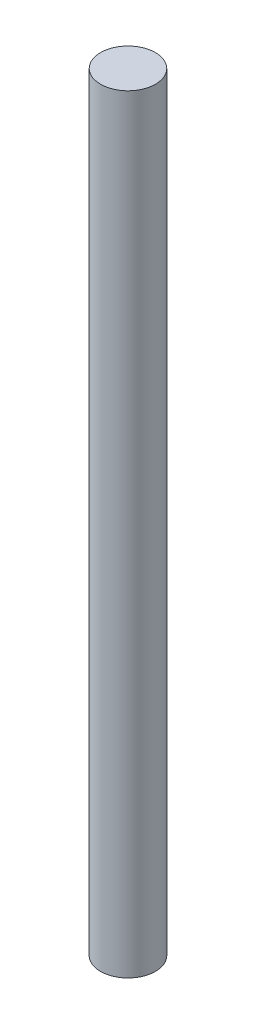
ISO-10303-21;
HEADER;
FILE_DESCRIPTION(('STEP AP214'),'2;1');
FILE_NAME('part.step','',(''),(''),'','','');
FILE_SCHEMA(('AUTOMOTIVE_DESIGN { 1 0 10303 214 1 1 1 1 }'));
ENDSEC;
DATA;
#1=APPLICATION_CONTEXT('core data for automotive mechanical design processes');
#2=APPLICATION_PROTOCOL_DEFINITION('international standard','automotive_design',2000,#1);
#3=PRODUCT_CONTEXT('',#1,'mechanical');
#4=PRODUCT('Part','Part','',(#3));
#5=PRODUCT_RELATED_PRODUCT_CATEGORY('part','',(#4));
#6=PRODUCT_DEFINITION_FORMATION('','',#4);
#7=PRODUCT_DEFINITION_CONTEXT('part definition',#1,'design');
#8=PRODUCT_DEFINITION('design','',#6,#7);
#9=PRODUCT_DEFINITION_SHAPE('','',#8);
#10=(LENGTH_UNIT() NAMED_UNIT(*) SI_UNIT(.MILLI.,.METRE.));
#11=(NAMED_UNIT(*) PLANE_ANGLE_UNIT() SI_UNIT($,.RADIAN.));
#12=(NAMED_UNIT(*) SI_UNIT($,.STERADIAN.) SOLID_ANGLE_UNIT());
#13=UNCERTAINTY_MEASURE_WITH_UNIT(LENGTH_MEASURE(1.E-05),#10,'distance_accuracy_value','');
#14=(GEOMETRIC_REPRESENTATION_CONTEXT(3) GLOBAL_UNCERTAINTY_ASSIGNED_CONTEXT((#13)) GLOBAL_UNIT_ASSIGNED_CONTEXT((#10,
#11,#12)) REPRESENTATION_CONTEXT('',''));
#15=CARTESIAN_POINT('',(0.,0.,0.));
#16=DIRECTION('',(0.,0.,1.));
#17=DIRECTION('',(1.,0.,0.));
#18=AXIS2_PLACEMENT_3D('',#15,#16,#17);
#19=CARTESIAN_POINT('',(0.,140.,0.));
#20=DIRECTION('',(0.,-1.,0.));
#21=DIRECTION('',(0.,0.,-1.));
#22=AXIS2_PLACEMENT_3D('',#19,#20,#21);
#23=CYLINDRICAL_SURFACE('',#22,5.);
#24=CARTESIAN_POINT('',(0.,140.,0.));
#25=DIRECTION('',(0.,1.,0.));
#26=DIRECTION('',(0.,0.,1.));
#27=AXIS2_PLACEMENT_3D('',#24,#25,#26);
#28=CIRCLE('',#27,5.);
#29=CARTESIAN_POINT('',(0.,140.,5.));
#30=VERTEX_POINT('',#29);
#31=EDGE_CURVE('E10',#30,#30,#28,.T.);
#32=ORIENTED_EDGE('',*,*,#31,.F.);
#33=EDGE_LOOP('',(#32));
#34=FACE_BOUND('',#33,.T.);
#35=CARTESIAN_POINT('',(0.,0.,0.));
#36=DIRECTION('',(0.,1.,0.));
#37=DIRECTION('',(0.,0.,1.));
#38=AXIS2_PLACEMENT_3D('',#35,#36,#37);
#39=CIRCLE('',#38,5.);
#40=CARTESIAN_POINT('',(0.,0.,5.));
#41=VERTEX_POINT('',#40);
#42=EDGE_CURVE('E40',#41,#41,#39,.T.);
#43=ORIENTED_EDGE('',*,*,#42,.T.);
#44=EDGE_LOOP('',(#43));
#45=FACE_BOUND('',#44,.T.);
#46=ADVANCED_FACE('F37',(#34,#45),#23,.T.);
#47=CARTESIAN_POINT('',(0.,140.,0.));
#48=DIRECTION('',(0.,1.,0.));
#49=DIRECTION('',(0.,0.,1.));
#50=AXIS2_PLACEMENT_3D('',#47,#48,#49);
#51=PLANE('',#50);
#52=ORIENTED_EDGE('',*,*,#31,.T.);
#53=EDGE_LOOP('',(#52));
#54=FACE_BOUND('',#53,.T.);
#55=ADVANCED_FACE('F52',(#54),#51,.T.);
#56=CARTESIAN_POINT('',(0.,0.,0.));
#57=DIRECTION('',(0.,1.,0.));
#58=DIRECTION('',(0.,0.,1.));
#59=AXIS2_PLACEMENT_3D('',#56,#57,#58);
#60=PLANE('',#59);
#61=ORIENTED_EDGE('',*,*,#42,.F.);
#62=EDGE_LOOP('',(#61));
#63=FACE_BOUND('',#62,.T.);
#64=ADVANCED_FACE('F50',(#63),#60,.F.);
#65=CLOSED_SHELL('',(#46,#55,#64));
#66=MANIFOLD_SOLID_BREP('B2',#65);
#67=ADVANCED_BREP_SHAPE_REPRESENTATION('',(#18,#66),#14);
#68=SHAPE_DEFINITION_REPRESENTATION(#9,#67);
ENDSEC;
END-ISO-10303-21;
